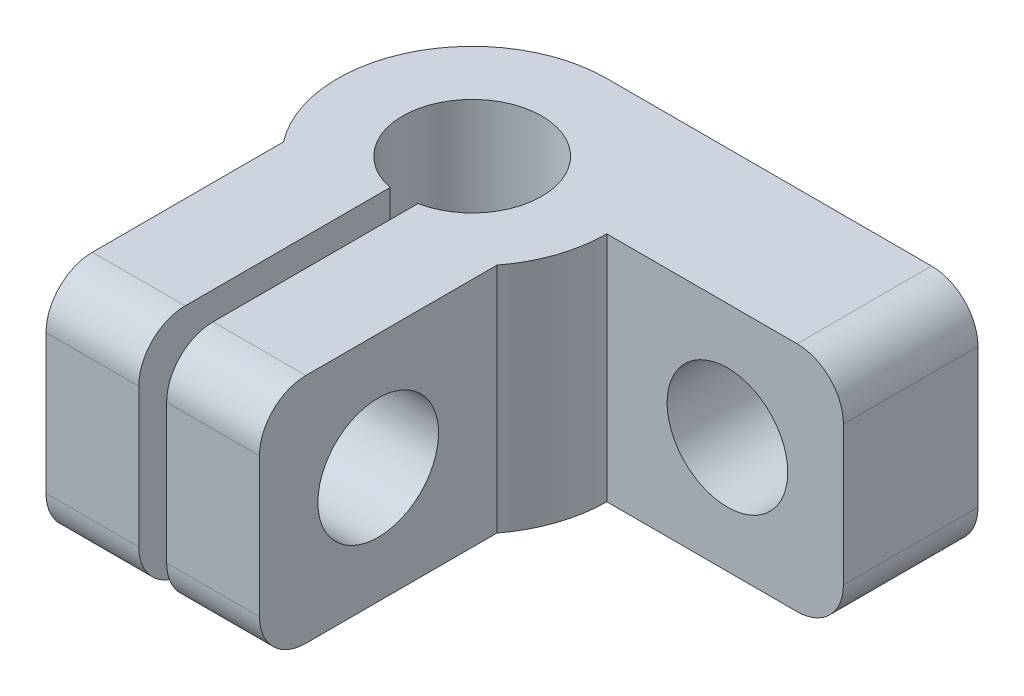
ISO-10303-21;
HEADER;
FILE_DESCRIPTION(('STEP AP214'),'2;1');
FILE_NAME('part.step','',(''),(''),'','','');
FILE_SCHEMA(('AUTOMOTIVE_DESIGN { 1 0 10303 214 1 1 1 1 }'));
ENDSEC;
DATA;
#1=APPLICATION_CONTEXT('core data for automotive mechanical design processes');
#2=APPLICATION_PROTOCOL_DEFINITION('international standard','automotive_design',2000,#1);
#3=PRODUCT_CONTEXT('',#1,'mechanical');
#4=PRODUCT('Part','Part','',(#3));
#5=PRODUCT_RELATED_PRODUCT_CATEGORY('part','',(#4));
#6=PRODUCT_DEFINITION_FORMATION('','',#4);
#7=PRODUCT_DEFINITION_CONTEXT('part definition',#1,'design');
#8=PRODUCT_DEFINITION('design','',#6,#7);
#9=PRODUCT_DEFINITION_SHAPE('','',#8);
#10=(LENGTH_UNIT() NAMED_UNIT(*) SI_UNIT(.MILLI.,.METRE.));
#11=(NAMED_UNIT(*) PLANE_ANGLE_UNIT() SI_UNIT($,.RADIAN.));
#12=(NAMED_UNIT(*) SI_UNIT($,.STERADIAN.) SOLID_ANGLE_UNIT());
#13=UNCERTAINTY_MEASURE_WITH_UNIT(LENGTH_MEASURE(1.E-05),#10,'distance_accuracy_value','');
#14=(GEOMETRIC_REPRESENTATION_CONTEXT(3) GLOBAL_UNCERTAINTY_ASSIGNED_CONTEXT((#13)) GLOBAL_UNIT_ASSIGNED_CONTEXT((#10,
#11,#12)) REPRESENTATION_CONTEXT('',''));
#15=CARTESIAN_POINT('',(0.,0.,0.));
#16=DIRECTION('',(0.,0.,1.));
#17=DIRECTION('',(1.,0.,0.));
#18=AXIS2_PLACEMENT_3D('',#15,#16,#17);
#19=CARTESIAN_POINT('',(2.3,5.,0.));
#20=DIRECTION('',(-1.,0.,0.));
#21=DIRECTION('',(0.,0.,1.));
#22=AXIS2_PLACEMENT_3D('',#19,#20,#21);
#23=PLANE('',#22);
#24=CARTESIAN_POINT('',(2.3,2.5,4.32539659681838));
#25=DIRECTION('',(-1.,0.,0.));
#26=DIRECTION('',(0.,0.,1.));
#27=AXIS2_PLACEMENT_3D('',#24,#25,#26);
#28=CIRCLE('',#27,1.3);
#29=CARTESIAN_POINT('',(2.3,2.5,5.62539659681838));
#30=VERTEX_POINT('',#29);
#31=EDGE_CURVE('E307',#30,#30,#28,.T.);
#32=ORIENTED_EDGE('',*,*,#31,.T.);
#33=EDGE_LOOP('',(#32));
#34=FACE_BOUND('',#33,.T.);
#35=DIRECTION('',(0.,-1.,0.));
#36=VECTOR('',#35,1.);
#37=CARTESIAN_POINT('',(2.3,5.,6.88444102037119));
#38=LINE('',#37,#36);
#39=CARTESIAN_POINT('',(2.3,4.,6.88444102037119));
#40=VERTEX_POINT('',#39);
#41=CARTESIAN_POINT('',(2.3,1.,6.88444102037119));
#42=VERTEX_POINT('',#41);
#43=EDGE_CURVE('E290',#40,#42,#38,.T.);
#44=ORIENTED_EDGE('',*,*,#43,.T.);
#45=CARTESIAN_POINT('',(2.3,1.,5.88444102037119));
#46=DIRECTION('',(-1.,0.,0.));
#47=DIRECTION('',(0.,0.,1.));
#48=AXIS2_PLACEMENT_3D('',#45,#46,#47);
#49=CIRCLE('',#48,1.);
#50=CARTESIAN_POINT('',(2.3,0.,5.88444102037119));
#51=VERTEX_POINT('',#50);
#52=EDGE_CURVE('E228',#42,#51,#49,.F.);
#53=ORIENTED_EDGE('',*,*,#52,.T.);
#54=DIRECTION('',(0.,0.,-1.));
#55=VECTOR('',#54,1.);
#56=CARTESIAN_POINT('',(2.3,0.,0.));
#57=LINE('',#56,#55);
#58=CARTESIAN_POINT('',(2.3,0.,1.76635217326557));
#59=VERTEX_POINT('',#58);
#60=EDGE_CURVE('E188',#51,#59,#57,.T.);
#61=ORIENTED_EDGE('',*,*,#60,.T.);
#62=DIRECTION('',(0.,-1.,0.));
#63=VECTOR('',#62,1.);
#64=CARTESIAN_POINT('',(2.3,5.,1.76635217326557));
#65=LINE('',#64,#63);
#66=CARTESIAN_POINT('',(2.3,5.,1.76635217326557));
#67=VERTEX_POINT('',#66);
#68=EDGE_CURVE('E181',#67,#59,#65,.T.);
#69=ORIENTED_EDGE('',*,*,#68,.F.);
#70=DIRECTION('',(0.,0.,-1.));
#71=VECTOR('',#70,1.);
#72=CARTESIAN_POINT('',(2.3,5.,0.));
#73=LINE('',#72,#71);
#74=CARTESIAN_POINT('',(2.3,5.,5.88444102037119));
#75=VERTEX_POINT('',#74);
#76=EDGE_CURVE('E165',#75,#67,#73,.T.);
#77=ORIENTED_EDGE('',*,*,#76,.F.);
#78=CARTESIAN_POINT('',(2.3,4.,5.88444102037119));
#79=DIRECTION('',(-1.,0.,0.));
#80=DIRECTION('',(0.,0.,1.));
#81=AXIS2_PLACEMENT_3D('',#78,#79,#80);
#82=CIRCLE('',#81,1.);
#83=EDGE_CURVE('E226',#75,#40,#82,.F.);
#84=ORIENTED_EDGE('',*,*,#83,.T.);
#85=EDGE_LOOP('',(#44,#53,#61,#69,#77,#84));
#86=FACE_BOUND('',#85,.T.);
#87=ADVANCED_FACE('F38',(#34,#86),#23,.F.);
#88=CARTESIAN_POINT('',(0.,5.,0.));
#89=DIRECTION('',(0.,-1.,0.));
#90=DIRECTION('',(0.,0.,-1.));
#91=AXIS2_PLACEMENT_3D('',#88,#89,#90);
#92=CYLINDRICAL_SURFACE('',#91,2.9);
#93=CARTESIAN_POINT('',(0.,0.,0.));
#94=DIRECTION('',(0.,1.,0.));
#95=DIRECTION('',(0.,0.,1.));
#96=AXIS2_PLACEMENT_3D('',#93,#94,#95);
#97=CIRCLE('',#96,2.9);
#98=CARTESIAN_POINT('',(2.9,0.,0.));
#99=VERTEX_POINT('',#98);
#100=EDGE_CURVE('E304',#59,#99,#97,.T.);
#101=ORIENTED_EDGE('',*,*,#100,.T.);
#102=DIRECTION('',(0.,-1.,0.));
#103=VECTOR('',#102,1.);
#104=CARTESIAN_POINT('',(2.9,5.,0.));
#105=LINE('',#104,#103);
#106=CARTESIAN_POINT('',(2.9,5.,0.));
#107=VERTEX_POINT('',#106);
#108=EDGE_CURVE('E183',#107,#99,#105,.T.);
#109=ORIENTED_EDGE('',*,*,#108,.F.);
#110=CARTESIAN_POINT('',(0.,5.,0.));
#111=DIRECTION('',(0.,1.,0.));
#112=DIRECTION('',(0.,0.,1.));
#113=AXIS2_PLACEMENT_3D('',#110,#111,#112);
#114=CIRCLE('',#113,2.9);
#115=EDGE_CURVE('E168',#67,#107,#114,.T.);
#116=ORIENTED_EDGE('',*,*,#115,.F.);
#117=ORIENTED_EDGE('',*,*,#68,.T.);
#118=EDGE_LOOP('',(#101,#109,#116,#117));
#119=FACE_BOUND('',#118,.T.);
#120=ADVANCED_FACE('F180',(#119),#92,.T.);
#121=CARTESIAN_POINT('',(0.,5.,0.));
#122=DIRECTION('',(0.,0.,1.));
#123=DIRECTION('',(1.,0.,0.));
#124=AXIS2_PLACEMENT_3D('',#121,#122,#123);
#125=PLANE('',#124);
#126=CARTESIAN_POINT('',(5.5,2.5,0.));
#127=DIRECTION('',(0.,0.,1.));
#128=DIRECTION('',(1.,0.,0.));
#129=AXIS2_PLACEMENT_3D('',#126,#127,#128);
#130=CIRCLE('',#129,1.3);
#131=CARTESIAN_POINT('',(6.8,2.5,0.));
#132=VERTEX_POINT('',#131);
#133=EDGE_CURVE('E329',#132,#132,#130,.T.);
#134=ORIENTED_EDGE('',*,*,#133,.F.);
#135=EDGE_LOOP('',(#134));
#136=FACE_BOUND('',#135,.T.);
#137=DIRECTION('',(-1.,0.,0.));
#138=VECTOR('',#137,1.);
#139=CARTESIAN_POINT('',(0.,0.,0.));
#140=LINE('',#139,#138);
#141=CARTESIAN_POINT('',(7.,0.,0.));
#142=VERTEX_POINT('',#141);
#143=EDGE_CURVE('E261',#142,#99,#140,.T.);
#144=ORIENTED_EDGE('',*,*,#143,.F.);
#145=CARTESIAN_POINT('',(7.,1.,0.));
#146=DIRECTION('',(0.,0.,1.));
#147=DIRECTION('',(1.,0.,0.));
#148=AXIS2_PLACEMENT_3D('',#145,#146,#147);
#149=CIRCLE('',#148,1.);
#150=CARTESIAN_POINT('',(8.,1.,0.));
#151=VERTEX_POINT('',#150);
#152=EDGE_CURVE('E239',#142,#151,#149,.T.);
#153=ORIENTED_EDGE('',*,*,#152,.T.);
#154=DIRECTION('',(0.,-1.,0.));
#155=VECTOR('',#154,1.);
#156=CARTESIAN_POINT('',(8.,5.,0.));
#157=LINE('',#156,#155);
#158=CARTESIAN_POINT('',(8.,4.,0.));
#159=VERTEX_POINT('',#158);
#160=EDGE_CURVE('E194',#159,#151,#157,.T.);
#161=ORIENTED_EDGE('',*,*,#160,.F.);
#162=CARTESIAN_POINT('',(7.,4.,0.));
#163=DIRECTION('',(0.,0.,1.));
#164=DIRECTION('',(1.,0.,0.));
#165=AXIS2_PLACEMENT_3D('',#162,#163,#164);
#166=CIRCLE('',#165,1.);
#167=CARTESIAN_POINT('',(7.,5.,0.));
#168=VERTEX_POINT('',#167);
#169=EDGE_CURVE('E237',#159,#168,#166,.T.);
#170=ORIENTED_EDGE('',*,*,#169,.T.);
#171=DIRECTION('',(-1.,0.,0.));
#172=VECTOR('',#171,1.);
#173=CARTESIAN_POINT('',(0.,5.,0.));
#174=LINE('',#173,#172);
#175=EDGE_CURVE('E184',#168,#107,#174,.T.);
#176=ORIENTED_EDGE('',*,*,#175,.T.);
#177=ORIENTED_EDGE('',*,*,#108,.T.);
#178=EDGE_LOOP('',(#144,#153,#161,#170,#176,#177));
#179=FACE_BOUND('',#178,.T.);
#180=ADVANCED_FACE('F266',(#136,#179),#125,.T.);
#181=CARTESIAN_POINT('',(8.,5.,0.));
#182=DIRECTION('',(1.,0.,0.));
#183=DIRECTION('',(0.,0.,-1.));
#184=AXIS2_PLACEMENT_3D('',#181,#182,#183);
#185=PLANE('',#184);
#186=ORIENTED_EDGE('',*,*,#160,.T.);
#187=DIRECTION('',(0.,0.,1.));
#188=VECTOR('',#187,1.);
#189=CARTESIAN_POINT('',(8.,1.,-2.9));
#190=LINE('',#189,#188);
#191=CARTESIAN_POINT('',(8.,1.,-2.9));
#192=VERTEX_POINT('',#191);
#193=EDGE_CURVE('E59',#151,#192,#190,.F.);
#194=ORIENTED_EDGE('',*,*,#193,.T.);
#195=DIRECTION('',(0.,-1.,0.));
#196=VECTOR('',#195,1.);
#197=CARTESIAN_POINT('',(8.,5.,-2.9));
#198=LINE('',#197,#196);
#199=CARTESIAN_POINT('',(8.,4.,-2.9));
#200=VERTEX_POINT('',#199);
#201=EDGE_CURVE('E252',#200,#192,#198,.T.);
#202=ORIENTED_EDGE('',*,*,#201,.F.);
#203=DIRECTION('',(0.,0.,1.));
#204=VECTOR('',#203,1.);
#205=CARTESIAN_POINT('',(8.,4.,0.));
#206=LINE('',#205,#204);
#207=EDGE_CURVE('E241',#200,#159,#206,.T.);
#208=ORIENTED_EDGE('',*,*,#207,.T.);
#209=EDGE_LOOP('',(#186,#194,#202,#208));
#210=FACE_BOUND('',#209,.T.);
#211=ADVANCED_FACE('F267',(#210),#185,.T.);
#212=CARTESIAN_POINT('',(0.,5.,-2.9));
#213=DIRECTION('',(0.,0.,-1.));
#214=DIRECTION('',(-1.,0.,0.));
#215=AXIS2_PLACEMENT_3D('',#212,#213,#214);
#216=PLANE('',#215);
#217=CARTESIAN_POINT('',(5.5,2.5,-2.9));
#218=DIRECTION('',(0.,0.,-1.));
#219=DIRECTION('',(-1.,0.,0.));
#220=AXIS2_PLACEMENT_3D('',#217,#218,#219);
#221=CIRCLE('',#220,1.3);
#222=CARTESIAN_POINT('',(4.2,2.5,-2.9));
#223=VERTEX_POINT('',#222);
#224=EDGE_CURVE('E332',#223,#223,#221,.T.);
#225=ORIENTED_EDGE('',*,*,#224,.F.);
#226=EDGE_LOOP('',(#225));
#227=FACE_BOUND('',#226,.T.);
#228=ORIENTED_EDGE('',*,*,#201,.T.);
#229=CARTESIAN_POINT('',(7.,1.,-2.9));
#230=DIRECTION('',(0.,0.,-1.));
#231=DIRECTION('',(-1.,0.,0.));
#232=AXIS2_PLACEMENT_3D('',#229,#230,#231);
#233=CIRCLE('',#232,1.);
#234=CARTESIAN_POINT('',(7.,0.,-2.9));
#235=VERTEX_POINT('',#234);
#236=EDGE_CURVE('E46',#192,#235,#233,.T.);
#237=ORIENTED_EDGE('',*,*,#236,.T.);
#238=DIRECTION('',(1.,0.,0.));
#239=VECTOR('',#238,1.);
#240=CARTESIAN_POINT('',(0.,0.,-2.9));
#241=LINE('',#240,#239);
#242=CARTESIAN_POINT('',(0.,0.,-2.9));
#243=VERTEX_POINT('',#242);
#244=EDGE_CURVE('E251',#243,#235,#241,.T.);
#245=ORIENTED_EDGE('',*,*,#244,.F.);
#246=DIRECTION('',(0.,-1.,0.));
#247=VECTOR('',#246,1.);
#248=CARTESIAN_POINT('',(0.,5.,-2.9));
#249=LINE('',#248,#247);
#250=CARTESIAN_POINT('',(0.,5.,-2.9));
#251=VERTEX_POINT('',#250);
#252=EDGE_CURVE('E269',#251,#243,#249,.T.);
#253=ORIENTED_EDGE('',*,*,#252,.F.);
#254=DIRECTION('',(1.,0.,0.));
#255=VECTOR('',#254,1.);
#256=CARTESIAN_POINT('',(0.,5.,-2.9));
#257=LINE('',#256,#255);
#258=CARTESIAN_POINT('',(7.,5.,-2.9));
#259=VERTEX_POINT('',#258);
#260=EDGE_CURVE('E320',#251,#259,#257,.T.);
#261=ORIENTED_EDGE('',*,*,#260,.T.);
#262=CARTESIAN_POINT('',(7.,4.,-2.9));
#263=DIRECTION('',(0.,0.,-1.));
#264=DIRECTION('',(-1.,0.,0.));
#265=AXIS2_PLACEMENT_3D('',#262,#263,#264);
#266=CIRCLE('',#265,1.);
#267=EDGE_CURVE('E245',#259,#200,#266,.T.);
#268=ORIENTED_EDGE('',*,*,#267,.T.);
#269=EDGE_LOOP('',(#228,#237,#245,#253,#261,#268));
#270=FACE_BOUND('',#269,.T.);
#271=ADVANCED_FACE('F250',(#227,#270),#216,.T.);
#272=CARTESIAN_POINT('',(0.,5.,0.));
#273=DIRECTION('',(0.,-1.,0.));
#274=DIRECTION('',(0.,0.,-1.));
#275=AXIS2_PLACEMENT_3D('',#272,#273,#274);
#276=CYLINDRICAL_SURFACE('',#275,2.9);
#277=CARTESIAN_POINT('',(0.,0.,0.));
#278=DIRECTION('',(0.,1.,0.));
#279=DIRECTION('',(0.,0.,1.));
#280=AXIS2_PLACEMENT_3D('',#277,#278,#279);
#281=CIRCLE('',#280,2.9);
#282=CARTESIAN_POINT('',(-2.3,0.,1.76635217326557));
#283=VERTEX_POINT('',#282);
#284=EDGE_CURVE('E260',#243,#283,#281,.T.);
#285=ORIENTED_EDGE('',*,*,#284,.T.);
#286=DIRECTION('',(0.,-1.,0.));
#287=VECTOR('',#286,1.);
#288=CARTESIAN_POINT('',(-2.3,5.,1.76635217326557));
#289=LINE('',#288,#287);
#290=CARTESIAN_POINT('',(-2.3,5.,1.76635217326557));
#291=VERTEX_POINT('',#290);
#292=EDGE_CURVE('E273',#291,#283,#289,.T.);
#293=ORIENTED_EDGE('',*,*,#292,.F.);
#294=CARTESIAN_POINT('',(0.,5.,0.));
#295=DIRECTION('',(0.,1.,0.));
#296=DIRECTION('',(0.,0.,1.));
#297=AXIS2_PLACEMENT_3D('',#294,#295,#296);
#298=CIRCLE('',#297,2.9);
#299=EDGE_CURVE('E317',#251,#291,#298,.T.);
#300=ORIENTED_EDGE('',*,*,#299,.F.);
#301=ORIENTED_EDGE('',*,*,#252,.T.);
#302=EDGE_LOOP('',(#285,#293,#300,#301));
#303=FACE_BOUND('',#302,.T.);
#304=ADVANCED_FACE('F339',(#303),#276,.T.);
#305=CARTESIAN_POINT('',(-2.3,5.,0.));
#306=DIRECTION('',(-1.,0.,0.));
#307=DIRECTION('',(0.,0.,1.));
#308=AXIS2_PLACEMENT_3D('',#305,#306,#307);
#309=PLANE('',#308);
#310=CARTESIAN_POINT('',(-2.3,2.5,4.32539659681838));
#311=DIRECTION('',(-1.,0.,0.));
#312=DIRECTION('',(0.,0.,1.));
#313=AXIS2_PLACEMENT_3D('',#310,#311,#312);
#314=CIRCLE('',#313,1.3);
#315=CARTESIAN_POINT('',(-2.3,2.5,5.62539659681838));
#316=VERTEX_POINT('',#315);
#317=EDGE_CURVE('E201',#316,#316,#314,.T.);
#318=ORIENTED_EDGE('',*,*,#317,.F.);
#319=EDGE_LOOP('',(#318));
#320=FACE_BOUND('',#319,.T.);
#321=DIRECTION('',(0.,-1.,0.));
#322=VECTOR('',#321,1.);
#323=CARTESIAN_POINT('',(-2.3,5.,6.88444102037119));
#324=LINE('',#323,#322);
#325=CARTESIAN_POINT('',(-2.3,4.,6.88444102037119));
#326=VERTEX_POINT('',#325);
#327=CARTESIAN_POINT('',(-2.3,1.,6.88444102037119));
#328=VERTEX_POINT('',#327);
#329=EDGE_CURVE('E276',#326,#328,#324,.T.);
#330=ORIENTED_EDGE('',*,*,#329,.F.);
#331=CARTESIAN_POINT('',(-2.3,4.,5.88444102037119));
#332=DIRECTION('',(-1.,0.,0.));
#333=DIRECTION('',(0.,0.,1.));
#334=AXIS2_PLACEMENT_3D('',#331,#332,#333);
#335=CIRCLE('',#334,1.);
#336=CARTESIAN_POINT('',(-2.3,5.,5.88444102037119));
#337=VERTEX_POINT('',#336);
#338=EDGE_CURVE('E207',#326,#337,#335,.T.);
#339=ORIENTED_EDGE('',*,*,#338,.T.);
#340=DIRECTION('',(0.,0.,-1.));
#341=VECTOR('',#340,1.);
#342=CARTESIAN_POINT('',(-2.3,5.,0.));
#343=LINE('',#342,#341);
#344=EDGE_CURVE('E315',#337,#291,#343,.T.);
#345=ORIENTED_EDGE('',*,*,#344,.T.);
#346=ORIENTED_EDGE('',*,*,#292,.T.);
#347=DIRECTION('',(0.,0.,-1.));
#348=VECTOR('',#347,1.);
#349=CARTESIAN_POINT('',(-2.3,0.,0.));
#350=LINE('',#349,#348);
#351=CARTESIAN_POINT('',(-2.3,0.,5.88444102037119));
#352=VERTEX_POINT('',#351);
#353=EDGE_CURVE('E300',#352,#283,#350,.T.);
#354=ORIENTED_EDGE('',*,*,#353,.F.);
#355=CARTESIAN_POINT('',(-2.3,1.,5.88444102037119));
#356=DIRECTION('',(-1.,0.,0.));
#357=DIRECTION('',(0.,0.,1.));
#358=AXIS2_PLACEMENT_3D('',#355,#356,#357);
#359=CIRCLE('',#358,1.);
#360=EDGE_CURVE('E205',#352,#328,#359,.T.);
#361=ORIENTED_EDGE('',*,*,#360,.T.);
#362=EDGE_LOOP('',(#330,#339,#345,#346,#354,#361));
#363=FACE_BOUND('',#362,.T.);
#364=ADVANCED_FACE('F345',(#320,#363),#309,.T.);
#365=CARTESIAN_POINT('',(0.,5.,6.88444102037119));
#366=DIRECTION('',(0.,0.,1.));
#367=DIRECTION('',(1.,0.,0.));
#368=AXIS2_PLACEMENT_3D('',#365,#366,#367);
#369=PLANE('',#368);
#370=DIRECTION('',(0.,-1.,0.));
#371=VECTOR('',#370,1.);
#372=CARTESIAN_POINT('',(-0.299999999999999,5.,6.88444102037119));
#373=LINE('',#372,#371);
#374=CARTESIAN_POINT('',(-0.299999999999999,4.,6.88444102037119));
#375=VERTEX_POINT('',#374);
#376=CARTESIAN_POINT('',(-0.299999999999999,1.,6.88444102037119));
#377=VERTEX_POINT('',#376);
#378=EDGE_CURVE('E279',#375,#377,#373,.T.);
#379=ORIENTED_EDGE('',*,*,#378,.F.);
#380=DIRECTION('',(-1.,0.,0.));
#381=VECTOR('',#380,1.);
#382=CARTESIAN_POINT('',(0.,4.,6.88444102037119));
#383=LINE('',#382,#381);
#384=EDGE_CURVE('E192',#375,#326,#383,.T.);
#385=ORIENTED_EDGE('',*,*,#384,.T.);
#386=ORIENTED_EDGE('',*,*,#329,.T.);
#387=DIRECTION('',(-1.,0.,0.));
#388=VECTOR('',#387,1.);
#389=CARTESIAN_POINT('',(-0.299999999999999,1.,6.88444102037119));
#390=LINE('',#389,#388);
#391=EDGE_CURVE('E190',#328,#377,#390,.F.);
#392=ORIENTED_EDGE('',*,*,#391,.T.);
#393=EDGE_LOOP('',(#379,#385,#386,#392));
#394=FACE_BOUND('',#393,.T.);
#395=ADVANCED_FACE('F392',(#394),#369,.T.);
#396=CARTESIAN_POINT('',(-0.3,5.,0.));
#397=DIRECTION('',(1.,0.,0.));
#398=DIRECTION('',(0.,0.,-1.));
#399=AXIS2_PLACEMENT_3D('',#396,#397,#398);
#400=PLANE('',#399);
#401=CARTESIAN_POINT('',(-0.3,2.5,4.32539659681838));
#402=DIRECTION('',(1.,0.,0.));
#403=DIRECTION('',(0.,0.,-1.));
#404=AXIS2_PLACEMENT_3D('',#401,#402,#403);
#405=CIRCLE('',#404,1.3);
#406=CARTESIAN_POINT('',(-0.3,2.5,5.62539659681838));
#407=VERTEX_POINT('',#406);
#408=EDGE_CURVE('E200',#407,#407,#405,.T.);
#409=ORIENTED_EDGE('',*,*,#408,.F.);
#410=EDGE_LOOP('',(#409));
#411=FACE_BOUND('',#410,.T.);
#412=DIRECTION('',(0.,0.,1.));
#413=VECTOR('',#412,1.);
#414=CARTESIAN_POINT('',(-0.3,5.,0.));
#415=LINE('',#414,#413);
#416=CARTESIAN_POINT('',(-0.3,5.,1.46969384566991));
#417=VERTEX_POINT('',#416);
#418=CARTESIAN_POINT('',(-0.299999999999999,5.,5.88444102037119));
#419=VERTEX_POINT('',#418);
#420=EDGE_CURVE('E312',#417,#419,#415,.T.);
#421=ORIENTED_EDGE('',*,*,#420,.T.);
#422=CARTESIAN_POINT('',(-0.299999999999999,4.,5.88444102037119));
#423=DIRECTION('',(1.,0.,0.));
#424=DIRECTION('',(0.,0.,-1.));
#425=AXIS2_PLACEMENT_3D('',#422,#423,#424);
#426=CIRCLE('',#425,1.);
#427=EDGE_CURVE('E214',#419,#375,#426,.T.);
#428=ORIENTED_EDGE('',*,*,#427,.T.);
#429=ORIENTED_EDGE('',*,*,#378,.T.);
#430=CARTESIAN_POINT('',(-0.299999999999999,1.,5.88444102037119));
#431=DIRECTION('',(1.,0.,0.));
#432=DIRECTION('',(0.,0.,-1.));
#433=AXIS2_PLACEMENT_3D('',#430,#431,#432);
#434=CIRCLE('',#433,1.);
#435=CARTESIAN_POINT('',(-0.299999999999999,0.,5.88444102037119));
#436=VERTEX_POINT('',#435);
#437=EDGE_CURVE('E212',#377,#436,#434,.T.);
#438=ORIENTED_EDGE('',*,*,#437,.T.);
#439=DIRECTION('',(0.,0.,1.));
#440=VECTOR('',#439,1.);
#441=CARTESIAN_POINT('',(-0.3,0.,0.));
#442=LINE('',#441,#440);
#443=CARTESIAN_POINT('',(-0.3,0.,1.46969384566991));
#444=VERTEX_POINT('',#443);
#445=EDGE_CURVE('E297',#444,#436,#442,.T.);
#446=ORIENTED_EDGE('',*,*,#445,.F.);
#447=DIRECTION('',(0.,-1.,0.));
#448=VECTOR('',#447,1.);
#449=CARTESIAN_POINT('',(-0.3,5.,1.46969384566991));
#450=LINE('',#449,#448);
#451=EDGE_CURVE('E282',#417,#444,#450,.T.);
#452=ORIENTED_EDGE('',*,*,#451,.F.);
#453=EDGE_LOOP('',(#421,#428,#429,#438,#446,#452));
#454=FACE_BOUND('',#453,.T.);
#455=ADVANCED_FACE('F396',(#411,#454),#400,.T.);
#456=CARTESIAN_POINT('',(0.,5.,0.));
#457=DIRECTION('',(0.,-1.,0.));
#458=DIRECTION('',(0.,0.,-1.));
#459=AXIS2_PLACEMENT_3D('',#456,#457,#458);
#460=CYLINDRICAL_SURFACE('',#459,1.5);
#461=CARTESIAN_POINT('',(0.,0.,0.));
#462=DIRECTION('',(0.,1.,0.));
#463=DIRECTION('',(0.,0.,1.));
#464=AXIS2_PLACEMENT_3D('',#461,#462,#463);
#465=CIRCLE('',#464,1.5);
#466=CARTESIAN_POINT('',(0.3,0.,1.46969384566991));
#467=VERTEX_POINT('',#466);
#468=EDGE_CURVE('E294',#467,#444,#465,.T.);
#469=ORIENTED_EDGE('',*,*,#468,.F.);
#470=DIRECTION('',(0.,-1.,0.));
#471=VECTOR('',#470,1.);
#472=CARTESIAN_POINT('',(0.3,5.,1.46969384566991));
#473=LINE('',#472,#471);
#474=CARTESIAN_POINT('',(0.3,5.,1.46969384566991));
#475=VERTEX_POINT('',#474);
#476=EDGE_CURVE('E284',#475,#467,#473,.T.);
#477=ORIENTED_EDGE('',*,*,#476,.F.);
#478=CARTESIAN_POINT('',(0.,5.,0.));
#479=DIRECTION('',(0.,1.,0.));
#480=DIRECTION('',(0.,0.,1.));
#481=AXIS2_PLACEMENT_3D('',#478,#479,#480);
#482=CIRCLE('',#481,1.5);
#483=EDGE_CURVE('E309',#475,#417,#482,.T.);
#484=ORIENTED_EDGE('',*,*,#483,.T.);
#485=ORIENTED_EDGE('',*,*,#451,.T.);
#486=EDGE_LOOP('',(#469,#477,#484,#485));
#487=FACE_BOUND('',#486,.T.);
#488=ADVANCED_FACE('F404',(#487),#460,.F.);
#489=CARTESIAN_POINT('',(0.3,5.,0.));
#490=DIRECTION('',(-1.,0.,0.));
#491=DIRECTION('',(0.,0.,1.));
#492=AXIS2_PLACEMENT_3D('',#489,#490,#491);
#493=PLANE('',#492);
#494=CARTESIAN_POINT('',(0.300000000000001,2.5,4.32539659681838));
#495=DIRECTION('',(-1.,0.,0.));
#496=DIRECTION('',(0.,0.,1.));
#497=AXIS2_PLACEMENT_3D('',#494,#495,#496);
#498=CIRCLE('',#497,1.3);
#499=CARTESIAN_POINT('',(0.300000000000001,2.5,5.62539659681838));
#500=VERTEX_POINT('',#499);
#501=EDGE_CURVE('E198',#500,#500,#498,.T.);
#502=ORIENTED_EDGE('',*,*,#501,.F.);
#503=EDGE_LOOP('',(#502));
#504=FACE_BOUND('',#503,.T.);
#505=DIRECTION('',(0.,0.,-1.));
#506=VECTOR('',#505,1.);
#507=CARTESIAN_POINT('',(0.3,0.,0.));
#508=LINE('',#507,#506);
#509=CARTESIAN_POINT('',(0.3,0.,5.88444102037119));
#510=VERTEX_POINT('',#509);
#511=EDGE_CURVE('E175',#510,#467,#508,.T.);
#512=ORIENTED_EDGE('',*,*,#511,.F.);
#513=CARTESIAN_POINT('',(0.3,1.,5.88444102037119));
#514=DIRECTION('',(-1.,0.,0.));
#515=DIRECTION('',(0.,0.,1.));
#516=AXIS2_PLACEMENT_3D('',#513,#514,#515);
#517=CIRCLE('',#516,1.);
#518=CARTESIAN_POINT('',(0.300000000000001,1.,6.88444102037119));
#519=VERTEX_POINT('',#518);
#520=EDGE_CURVE('E232',#510,#519,#517,.T.);
#521=ORIENTED_EDGE('',*,*,#520,.T.);
#522=DIRECTION('',(0.,-1.,0.));
#523=VECTOR('',#522,1.);
#524=CARTESIAN_POINT('',(0.300000000000001,5.,6.88444102037119));
#525=LINE('',#524,#523);
#526=CARTESIAN_POINT('',(0.300000000000001,4.,6.88444102037119));
#527=VERTEX_POINT('',#526);
#528=EDGE_CURVE('E287',#527,#519,#525,.T.);
#529=ORIENTED_EDGE('',*,*,#528,.F.);
#530=CARTESIAN_POINT('',(0.3,4.,5.88444102037119));
#531=DIRECTION('',(-1.,0.,0.));
#532=DIRECTION('',(0.,0.,1.));
#533=AXIS2_PLACEMENT_3D('',#530,#531,#532);
#534=CIRCLE('',#533,1.);
#535=CARTESIAN_POINT('',(0.3,5.,5.88444102037119));
#536=VERTEX_POINT('',#535);
#537=EDGE_CURVE('E230',#527,#536,#534,.T.);
#538=ORIENTED_EDGE('',*,*,#537,.T.);
#539=DIRECTION('',(0.,0.,-1.));
#540=VECTOR('',#539,1.);
#541=CARTESIAN_POINT('',(0.3,5.,0.));
#542=LINE('',#541,#540);
#543=EDGE_CURVE('E292',#536,#475,#542,.T.);
#544=ORIENTED_EDGE('',*,*,#543,.T.);
#545=ORIENTED_EDGE('',*,*,#476,.T.);
#546=EDGE_LOOP('',(#512,#521,#529,#538,#544,#545));
#547=FACE_BOUND('',#546,.T.);
#548=ADVANCED_FACE('F407',(#504,#547),#493,.T.);
#549=CARTESIAN_POINT('',(0.,5.,6.88444102037119));
#550=DIRECTION('',(0.,0.,-1.));
#551=DIRECTION('',(-1.,0.,0.));
#552=AXIS2_PLACEMENT_3D('',#549,#550,#551);
#553=PLANE('',#552);
#554=ORIENTED_EDGE('',*,*,#528,.T.);
#555=DIRECTION('',(1.,0.,0.));
#556=VECTOR('',#555,1.);
#557=CARTESIAN_POINT('',(0.,1.,6.88444102037119));
#558=LINE('',#557,#556);
#559=EDGE_CURVE('E223',#519,#42,#558,.T.);
#560=ORIENTED_EDGE('',*,*,#559,.T.);
#561=ORIENTED_EDGE('',*,*,#43,.F.);
#562=DIRECTION('',(1.,0.,0.));
#563=VECTOR('',#562,1.);
#564=CARTESIAN_POINT('',(0.300000000000001,4.,6.88444102037119));
#565=LINE('',#564,#563);
#566=EDGE_CURVE('E221',#40,#527,#565,.F.);
#567=ORIENTED_EDGE('',*,*,#566,.T.);
#568=EDGE_LOOP('',(#554,#560,#561,#567));
#569=FACE_BOUND('',#568,.T.);
#570=ADVANCED_FACE('F414',(#569),#553,.F.);
#571=CARTESIAN_POINT('',(0.,5.,0.));
#572=DIRECTION('',(0.,1.,0.));
#573=DIRECTION('',(0.,0.,1.));
#574=AXIS2_PLACEMENT_3D('',#571,#572,#573);
#575=PLANE('',#574);
#576=ORIENTED_EDGE('',*,*,#175,.F.);
#577=DIRECTION('',(0.,0.,1.));
#578=VECTOR('',#577,1.);
#579=CARTESIAN_POINT('',(7.,5.,0.));
#580=LINE('',#579,#578);
#581=EDGE_CURVE('E11',#168,#259,#580,.F.);
#582=ORIENTED_EDGE('',*,*,#581,.T.);
#583=ORIENTED_EDGE('',*,*,#260,.F.);
#584=ORIENTED_EDGE('',*,*,#299,.T.);
#585=ORIENTED_EDGE('',*,*,#344,.F.);
#586=DIRECTION('',(-1.,0.,0.));
#587=VECTOR('',#586,1.);
#588=CARTESIAN_POINT('',(0.,5.,5.88444102037119));
#589=LINE('',#588,#587);
#590=EDGE_CURVE('E210',#337,#419,#589,.F.);
#591=ORIENTED_EDGE('',*,*,#590,.T.);
#592=ORIENTED_EDGE('',*,*,#420,.F.);
#593=ORIENTED_EDGE('',*,*,#483,.F.);
#594=ORIENTED_EDGE('',*,*,#543,.F.);
#595=DIRECTION('',(1.,0.,0.));
#596=VECTOR('',#595,1.);
#597=CARTESIAN_POINT('',(2.3,5.,5.88444102037119));
#598=LINE('',#597,#596);
#599=EDGE_CURVE('E172',#536,#75,#598,.T.);
#600=ORIENTED_EDGE('',*,*,#599,.T.);
#601=ORIENTED_EDGE('',*,*,#76,.T.);
#602=ORIENTED_EDGE('',*,*,#115,.T.);
#603=EDGE_LOOP('',(#576,#582,#583,#584,#585,#591,#592,#593,#594,#600,#601,#602));
#604=FACE_BOUND('',#603,.T.);
#605=ADVANCED_FACE('F167',(#604),#575,.T.);
#606=CARTESIAN_POINT('',(0.,0.,0.));
#607=DIRECTION('',(0.,1.,0.));
#608=DIRECTION('',(0.,0.,1.));
#609=AXIS2_PLACEMENT_3D('',#606,#607,#608);
#610=PLANE('',#609);
#611=ORIENTED_EDGE('',*,*,#244,.T.);
#612=DIRECTION('',(0.,0.,1.));
#613=VECTOR('',#612,1.);
#614=CARTESIAN_POINT('',(7.,0.,0.));
#615=LINE('',#614,#613);
#616=EDGE_CURVE('E234',#235,#142,#615,.T.);
#617=ORIENTED_EDGE('',*,*,#616,.T.);
#618=ORIENTED_EDGE('',*,*,#143,.T.);
#619=ORIENTED_EDGE('',*,*,#100,.F.);
#620=ORIENTED_EDGE('',*,*,#60,.F.);
#621=DIRECTION('',(1.,0.,0.));
#622=VECTOR('',#621,1.);
#623=CARTESIAN_POINT('',(0.,0.,5.88444102037119));
#624=LINE('',#623,#622);
#625=EDGE_CURVE('E216',#51,#510,#624,.F.);
#626=ORIENTED_EDGE('',*,*,#625,.T.);
#627=ORIENTED_EDGE('',*,*,#511,.T.);
#628=ORIENTED_EDGE('',*,*,#468,.T.);
#629=ORIENTED_EDGE('',*,*,#445,.T.);
#630=DIRECTION('',(-1.,0.,0.));
#631=VECTOR('',#630,1.);
#632=CARTESIAN_POINT('',(-2.3,0.,5.88444102037119));
#633=LINE('',#632,#631);
#634=EDGE_CURVE('E218',#436,#352,#633,.T.);
#635=ORIENTED_EDGE('',*,*,#634,.T.);
#636=ORIENTED_EDGE('',*,*,#353,.T.);
#637=ORIENTED_EDGE('',*,*,#284,.F.);
#638=EDGE_LOOP('',(#611,#617,#618,#619,#620,#626,#627,#628,#629,#635,#636,#637));
#639=FACE_BOUND('',#638,.T.);
#640=ADVANCED_FACE('F257',(#639),#610,.F.);
#641=CARTESIAN_POINT('',(8.,2.5,4.32539659681838));
#642=DIRECTION('',(-1.,0.,0.));
#643=DIRECTION('',(0.,0.,1.));
#644=AXIS2_PLACEMENT_3D('',#641,#642,#643);
#645=CYLINDRICAL_SURFACE('',#644,1.3);
#646=CARTESIAN_POINT('',(0.300000000000001,2.5,5.62539659681838));
#647=CARTESIAN_POINT('',(0.320833333333334,2.5,5.62539659681838));
#648=CARTESIAN_POINT('',(0.341666666666667,2.5,5.62539659681838));
#649=CARTESIAN_POINT('',(0.383333333333334,2.5,5.62539659681838));
#650=CARTESIAN_POINT('',(0.404166666666668,2.5,5.62539659681838));
#651=CARTESIAN_POINT('',(0.445833333333334,2.5,5.62539659681838));
#652=CARTESIAN_POINT('',(0.466666666666668,2.5,5.62539659681838));
#653=CARTESIAN_POINT('',(0.508333333333334,2.5,5.62539659681838));
#654=CARTESIAN_POINT('',(0.529166666666668,2.5,5.62539659681838));
#655=CARTESIAN_POINT('',(0.570833333333334,2.5,5.62539659681838));
#656=CARTESIAN_POINT('',(0.591666666666668,2.5,5.62539659681838));
#657=CARTESIAN_POINT('',(0.633333333333334,2.5,5.62539659681838));
#658=CARTESIAN_POINT('',(0.654166666666668,2.5,5.62539659681838));
#659=CARTESIAN_POINT('',(0.695833333333334,2.5,5.62539659681838));
#660=CARTESIAN_POINT('',(0.716666666666668,2.5,5.62539659681838));
#661=CARTESIAN_POINT('',(0.758333333333335,2.5,5.62539659681838));
#662=CARTESIAN_POINT('',(0.779166666666668,2.5,5.62539659681838));
#663=CARTESIAN_POINT('',(0.820833333333335,2.5,5.62539659681838));
#664=CARTESIAN_POINT('',(0.841666666666668,2.5,5.62539659681838));
#665=CARTESIAN_POINT('',(0.883333333333334,2.5,5.62539659681838));
#666=CARTESIAN_POINT('',(0.904166666666667,2.5,5.62539659681838));
#667=CARTESIAN_POINT('',(0.945833333333334,2.5,5.62539659681838));
#668=CARTESIAN_POINT('',(0.966666666666667,2.5,5.62539659681838));
#669=CARTESIAN_POINT('',(1.00833333333333,2.5,5.62539659681838));
#670=CARTESIAN_POINT('',(1.02916666666667,2.5,5.62539659681838));
#671=CARTESIAN_POINT('',(1.07083333333333,2.5,5.62539659681838));
#672=CARTESIAN_POINT('',(1.09166666666667,2.5,5.62539659681838));
#673=CARTESIAN_POINT('',(1.13333333333333,2.5,5.62539659681838));
#674=CARTESIAN_POINT('',(1.15416666666667,2.5,5.62539659681838));
#675=CARTESIAN_POINT('',(1.19583333333333,2.5,5.62539659681838));
#676=CARTESIAN_POINT('',(1.21666666666667,2.5,5.62539659681838));
#677=CARTESIAN_POINT('',(1.25833333333333,2.5,5.62539659681838));
#678=CARTESIAN_POINT('',(1.27916666666667,2.5,5.62539659681838));
#679=CARTESIAN_POINT('',(1.32083333333333,2.5,5.62539659681838));
#680=CARTESIAN_POINT('',(1.34166666666667,2.5,5.62539659681838));
#681=CARTESIAN_POINT('',(1.38333333333333,2.5,5.62539659681838));
#682=CARTESIAN_POINT('',(1.40416666666667,2.5,5.62539659681838));
#683=CARTESIAN_POINT('',(1.44583333333333,2.5,5.62539659681838));
#684=CARTESIAN_POINT('',(1.46666666666667,2.5,5.62539659681838));
#685=CARTESIAN_POINT('',(1.50833333333333,2.5,5.62539659681838));
#686=CARTESIAN_POINT('',(1.52916666666667,2.5,5.62539659681838));
#687=CARTESIAN_POINT('',(1.57083333333333,2.5,5.62539659681838));
#688=CARTESIAN_POINT('',(1.59166666666667,2.5,5.62539659681838));
#689=CARTESIAN_POINT('',(1.63333333333333,2.5,5.62539659681838));
#690=CARTESIAN_POINT('',(1.65416666666667,2.5,5.62539659681838));
#691=CARTESIAN_POINT('',(1.69583333333333,2.5,5.62539659681838));
#692=CARTESIAN_POINT('',(1.71666666666667,2.5,5.62539659681838));
#693=CARTESIAN_POINT('',(1.75833333333333,2.5,5.62539659681838));
#694=CARTESIAN_POINT('',(1.77916666666667,2.5,5.62539659681838));
#695=CARTESIAN_POINT('',(1.82083333333333,2.5,5.62539659681838));
#696=CARTESIAN_POINT('',(1.84166666666667,2.5,5.62539659681838));
#697=CARTESIAN_POINT('',(1.88333333333333,2.5,5.62539659681838));
#698=CARTESIAN_POINT('',(1.90416666666667,2.5,5.62539659681838));
#699=CARTESIAN_POINT('',(1.94583333333333,2.5,5.62539659681838));
#700=CARTESIAN_POINT('',(1.96666666666667,2.5,5.62539659681838));
#701=CARTESIAN_POINT('',(2.00833333333333,2.5,5.62539659681838));
#702=CARTESIAN_POINT('',(2.02916666666667,2.5,5.62539659681838));
#703=CARTESIAN_POINT('',(2.07083333333333,2.5,5.62539659681838));
#704=CARTESIAN_POINT('',(2.09166666666667,2.5,5.62539659681838));
#705=CARTESIAN_POINT('',(2.13333333333333,2.5,5.62539659681838));
#706=CARTESIAN_POINT('',(2.15416666666667,2.5,5.62539659681838));
#707=CARTESIAN_POINT('',(2.19583333333333,2.5,5.62539659681838));
#708=CARTESIAN_POINT('',(2.21666666666667,2.5,5.62539659681838));
#709=CARTESIAN_POINT('',(2.25833333333333,2.5,5.62539659681838));
#710=CARTESIAN_POINT('',(2.27916666666667,2.5,5.62539659681838));
#711=CARTESIAN_POINT('',(2.3,2.5,5.62539659681838));
#712=B_SPLINE_CURVE_WITH_KNOTS('',3,(#646,#647,#648,#649,#650,#651,#652,#653,#654,#655,#656,
#657,#658,#659,#660,#661,#662,#663,#664,#665,#666,#667,#668,#669,#670,#671,#672,#673,#674,#675,
#676,#677,#678,#679,#680,#681,#682,#683,#684,#685,#686,#687,#688,#689,#690,#691,#692,#693,#694,
#695,#696,#697,#698,#699,#700,#701,#702,#703,#704,#705,#706,#707,#708,#709,#710,#711),
.UNSPECIFIED.,.F.,.F.,(4,2,2,2,2,2,2,2,2,2,2,2,2,2,2,2,2,2,2,2,2,2,2,2,2,2,2,2,2,2,2,2,4),(0.,
0.0625000000000001,0.125,0.1875,0.25,0.3125,0.375,0.4375,0.5,0.5625,0.625,0.6875,0.75,0.8125,
0.875,0.9375,1.,1.0625,1.125,1.1875,1.25,1.3125,1.375,1.4375,1.5,1.5625,1.625,1.6875,1.75,
1.8125,1.875,1.9375,2.),.UNSPECIFIED.);
#713=EDGE_CURVE('BSEAM443',#500,#30,#712,.T.);
#714=ORIENTED_EDGE('',*,*,#501,.T.);
#715=ORIENTED_EDGE('',*,*,#31,.F.);
#716=ORIENTED_EDGE('',*,*,#713,.T.);
#717=ORIENTED_EDGE('',*,*,#713,.F.);
#718=EDGE_LOOP('',(#714,#716,#715,#717));
#719=FACE_BOUND('',#718,.T.);
#720=ADVANCED_FACE('F443',(#719),#645,.F.);
#721=CARTESIAN_POINT('',(-0.3,2.5,5.62539659681838));
#722=CARTESIAN_POINT('',(-0.320833333333333,2.5,5.62539659681838));
#723=CARTESIAN_POINT('',(-0.341666666666667,2.5,5.62539659681838));
#724=CARTESIAN_POINT('',(-0.383333333333333,2.5,5.62539659681838));
#725=CARTESIAN_POINT('',(-0.404166666666667,2.5,5.62539659681838));
#726=CARTESIAN_POINT('',(-0.445833333333333,2.5,5.62539659681838));
#727=CARTESIAN_POINT('',(-0.466666666666667,2.5,5.62539659681838));
#728=CARTESIAN_POINT('',(-0.508333333333333,2.5,5.62539659681838));
#729=CARTESIAN_POINT('',(-0.529166666666667,2.5,5.62539659681838));
#730=CARTESIAN_POINT('',(-0.570833333333333,2.5,5.62539659681838));
#731=CARTESIAN_POINT('',(-0.591666666666667,2.5,5.62539659681838));
#732=CARTESIAN_POINT('',(-0.633333333333334,2.5,5.62539659681838));
#733=CARTESIAN_POINT('',(-0.654166666666667,2.5,5.62539659681838));
#734=CARTESIAN_POINT('',(-0.695833333333334,2.5,5.62539659681838));
#735=CARTESIAN_POINT('',(-0.716666666666667,2.5,5.62539659681838));
#736=CARTESIAN_POINT('',(-0.758333333333334,2.5,5.62539659681838));
#737=CARTESIAN_POINT('',(-0.779166666666667,2.5,5.62539659681838));
#738=CARTESIAN_POINT('',(-0.820833333333333,2.5,5.62539659681838));
#739=CARTESIAN_POINT('',(-0.841666666666666,2.5,5.62539659681838));
#740=CARTESIAN_POINT('',(-0.883333333333332,2.5,5.62539659681838));
#741=CARTESIAN_POINT('',(-0.904166666666665,2.5,5.62539659681838));
#742=CARTESIAN_POINT('',(-0.945833333333332,2.5,5.62539659681838));
#743=CARTESIAN_POINT('',(-0.966666666666665,2.5,5.62539659681838));
#744=CARTESIAN_POINT('',(-1.00833333333333,2.5,5.62539659681838));
#745=CARTESIAN_POINT('',(-1.02916666666667,2.5,5.62539659681838));
#746=CARTESIAN_POINT('',(-1.07083333333333,2.5,5.62539659681838));
#747=CARTESIAN_POINT('',(-1.09166666666667,2.5,5.62539659681838));
#748=CARTESIAN_POINT('',(-1.13333333333333,2.5,5.62539659681838));
#749=CARTESIAN_POINT('',(-1.15416666666667,2.5,5.62539659681838));
#750=CARTESIAN_POINT('',(-1.19583333333333,2.5,5.62539659681838));
#751=CARTESIAN_POINT('',(-1.21666666666667,2.5,5.62539659681838));
#752=CARTESIAN_POINT('',(-1.25833333333333,2.5,5.62539659681838));
#753=CARTESIAN_POINT('',(-1.27916666666667,2.5,5.62539659681838));
#754=CARTESIAN_POINT('',(-1.32083333333333,2.5,5.62539659681838));
#755=CARTESIAN_POINT('',(-1.34166666666667,2.5,5.62539659681838));
#756=CARTESIAN_POINT('',(-1.38333333333333,2.5,5.62539659681838));
#757=CARTESIAN_POINT('',(-1.40416666666667,2.5,5.62539659681838));
#758=CARTESIAN_POINT('',(-1.44583333333333,2.5,5.62539659681838));
#759=CARTESIAN_POINT('',(-1.46666666666667,2.5,5.62539659681838));
#760=CARTESIAN_POINT('',(-1.50833333333333,2.5,5.62539659681838));
#761=CARTESIAN_POINT('',(-1.52916666666667,2.5,5.62539659681838));
#762=CARTESIAN_POINT('',(-1.57083333333333,2.5,5.62539659681838));
#763=CARTESIAN_POINT('',(-1.59166666666667,2.5,5.62539659681838));
#764=CARTESIAN_POINT('',(-1.63333333333333,2.5,5.62539659681838));
#765=CARTESIAN_POINT('',(-1.65416666666667,2.5,5.62539659681838));
#766=CARTESIAN_POINT('',(-1.69583333333333,2.5,5.62539659681838));
#767=CARTESIAN_POINT('',(-1.71666666666667,2.5,5.62539659681838));
#768=CARTESIAN_POINT('',(-1.75833333333333,2.5,5.62539659681838));
#769=CARTESIAN_POINT('',(-1.77916666666666,2.5,5.62539659681838));
#770=CARTESIAN_POINT('',(-1.82083333333333,2.5,5.62539659681838));
#771=CARTESIAN_POINT('',(-1.84166666666666,2.5,5.62539659681838));
#772=CARTESIAN_POINT('',(-1.88333333333333,2.5,5.62539659681838));
#773=CARTESIAN_POINT('',(-1.90416666666666,2.5,5.62539659681838));
#774=CARTESIAN_POINT('',(-1.94583333333333,2.5,5.62539659681838));
#775=CARTESIAN_POINT('',(-1.96666666666666,2.5,5.62539659681838));
#776=CARTESIAN_POINT('',(-2.00833333333333,2.5,5.62539659681838));
#777=CARTESIAN_POINT('',(-2.02916666666667,2.5,5.62539659681838));
#778=CARTESIAN_POINT('',(-2.07083333333333,2.5,5.62539659681838));
#779=CARTESIAN_POINT('',(-2.09166666666667,2.5,5.62539659681838));
#780=CARTESIAN_POINT('',(-2.13333333333333,2.5,5.62539659681838));
#781=CARTESIAN_POINT('',(-2.15416666666667,2.5,5.62539659681838));
#782=CARTESIAN_POINT('',(-2.19583333333333,2.5,5.62539659681838));
#783=CARTESIAN_POINT('',(-2.21666666666667,2.5,5.62539659681838));
#784=CARTESIAN_POINT('',(-2.25833333333333,2.5,5.62539659681838));
#785=CARTESIAN_POINT('',(-2.27916666666667,2.5,5.62539659681838));
#786=CARTESIAN_POINT('',(-2.3,2.5,5.62539659681838));
#787=B_SPLINE_CURVE_WITH_KNOTS('',3,(#721,#722,#723,#724,#725,#726,#727,#728,#729,#730,#731,
#732,#733,#734,#735,#736,#737,#738,#739,#740,#741,#742,#743,#744,#745,#746,#747,#748,#749,#750,
#751,#752,#753,#754,#755,#756,#757,#758,#759,#760,#761,#762,#763,#764,#765,#766,#767,#768,#769,
#770,#771,#772,#773,#774,#775,#776,#777,#778,#779,#780,#781,#782,#783,#784,#785,#786),
.UNSPECIFIED.,.F.,.F.,(4,2,2,2,2,2,2,2,2,2,2,2,2,2,2,2,2,2,2,2,2,2,2,2,2,2,2,2,2,2,2,2,4),(0.,
0.0625000000000001,0.125,0.1875,0.25,0.3125,0.375,0.4375,0.5,0.562499999999999,
0.624999999999999,0.687499999999999,0.749999999999999,0.812499999999999,0.874999999999999,
0.937499999999999,0.999999999999999,1.0625,1.125,1.1875,1.25,1.3125,1.375,1.4375,1.5,1.5625,
1.625,1.6875,1.75,1.8125,1.875,1.9375,2.),.UNSPECIFIED.);
#788=EDGE_CURVE('BSEAM441',#407,#316,#787,.T.);
#789=ORIENTED_EDGE('',*,*,#408,.T.);
#790=ORIENTED_EDGE('',*,*,#317,.T.);
#791=ORIENTED_EDGE('',*,*,#788,.T.);
#792=ORIENTED_EDGE('',*,*,#788,.F.);
#793=EDGE_LOOP('',(#789,#791,#790,#792));
#794=FACE_BOUND('',#793,.T.);
#795=ADVANCED_FACE('F441',(#794),#645,.F.);
#796=CARTESIAN_POINT('',(5.5,2.5,6.88444102037119));
#797=DIRECTION('',(0.,0.,-1.));
#798=DIRECTION('',(-1.,0.,0.));
#799=AXIS2_PLACEMENT_3D('',#796,#797,#798);
#800=CYLINDRICAL_SURFACE('',#799,1.3);
#801=ORIENTED_EDGE('',*,*,#133,.T.);
#802=EDGE_LOOP('',(#801));
#803=FACE_BOUND('',#802,.T.);
#804=ORIENTED_EDGE('',*,*,#224,.T.);
#805=EDGE_LOOP('',(#804));
#806=FACE_BOUND('',#805,.T.);
#807=ADVANCED_FACE('F336',(#803,#806),#800,.F.);
#808=CARTESIAN_POINT('',(0.,4.,5.88444102037119));
#809=DIRECTION('',(-1.,0.,0.));
#810=DIRECTION('',(0.,0.,1.));
#811=AXIS2_PLACEMENT_3D('',#808,#809,#810);
#812=CYLINDRICAL_SURFACE('',#811,1.);
#813=ORIENTED_EDGE('',*,*,#427,.F.);
#814=ORIENTED_EDGE('',*,*,#590,.F.);
#815=ORIENTED_EDGE('',*,*,#338,.F.);
#816=ORIENTED_EDGE('',*,*,#384,.F.);
#817=EDGE_LOOP('',(#813,#814,#815,#816));
#818=FACE_BOUND('',#817,.T.);
#819=ADVANCED_FACE('F358',(#818),#812,.T.);
#820=CARTESIAN_POINT('',(0.,1.,5.88444102037119));
#821=DIRECTION('',(1.,0.,0.));
#822=DIRECTION('',(0.,0.,-1.));
#823=AXIS2_PLACEMENT_3D('',#820,#821,#822);
#824=CYLINDRICAL_SURFACE('',#823,1.);
#825=ORIENTED_EDGE('',*,*,#437,.F.);
#826=ORIENTED_EDGE('',*,*,#391,.F.);
#827=ORIENTED_EDGE('',*,*,#360,.F.);
#828=ORIENTED_EDGE('',*,*,#634,.F.);
#829=EDGE_LOOP('',(#825,#826,#827,#828));
#830=FACE_BOUND('',#829,.T.);
#831=ADVANCED_FACE('F361',(#830),#824,.T.);
#832=CARTESIAN_POINT('',(0.,1.,5.88444102037119));
#833=DIRECTION('',(1.,0.,0.));
#834=DIRECTION('',(0.,0.,-1.));
#835=AXIS2_PLACEMENT_3D('',#832,#833,#834);
#836=CYLINDRICAL_SURFACE('',#835,1.);
#837=ORIENTED_EDGE('',*,*,#520,.F.);
#838=ORIENTED_EDGE('',*,*,#625,.F.);
#839=ORIENTED_EDGE('',*,*,#52,.F.);
#840=ORIENTED_EDGE('',*,*,#559,.F.);
#841=EDGE_LOOP('',(#837,#838,#839,#840));
#842=FACE_BOUND('',#841,.T.);
#843=ADVANCED_FACE('F365',(#842),#836,.T.);
#844=CARTESIAN_POINT('',(0.,4.,5.88444102037119));
#845=DIRECTION('',(-1.,0.,0.));
#846=DIRECTION('',(0.,0.,1.));
#847=AXIS2_PLACEMENT_3D('',#844,#845,#846);
#848=CYLINDRICAL_SURFACE('',#847,1.);
#849=ORIENTED_EDGE('',*,*,#537,.F.);
#850=ORIENTED_EDGE('',*,*,#566,.F.);
#851=ORIENTED_EDGE('',*,*,#83,.F.);
#852=ORIENTED_EDGE('',*,*,#599,.F.);
#853=EDGE_LOOP('',(#849,#850,#851,#852));
#854=FACE_BOUND('',#853,.T.);
#855=ADVANCED_FACE('F369',(#854),#848,.T.);
#856=CARTESIAN_POINT('',(7.,1.,0.));
#857=DIRECTION('',(0.,0.,-1.));
#858=DIRECTION('',(-1.,0.,0.));
#859=AXIS2_PLACEMENT_3D('',#856,#857,#858);
#860=CYLINDRICAL_SURFACE('',#859,1.);
#861=ORIENTED_EDGE('',*,*,#236,.F.);
#862=ORIENTED_EDGE('',*,*,#193,.F.);
#863=ORIENTED_EDGE('',*,*,#152,.F.);
#864=ORIENTED_EDGE('',*,*,#616,.F.);
#865=EDGE_LOOP('',(#861,#862,#863,#864));
#866=FACE_BOUND('',#865,.T.);
#867=ADVANCED_FACE('F263',(#866),#860,.T.);
#868=CARTESIAN_POINT('',(7.,4.,0.));
#869=DIRECTION('',(0.,0.,1.));
#870=DIRECTION('',(1.,0.,0.));
#871=AXIS2_PLACEMENT_3D('',#868,#869,#870);
#872=CYLINDRICAL_SURFACE('',#871,1.);
#873=ORIENTED_EDGE('',*,*,#267,.F.);
#874=ORIENTED_EDGE('',*,*,#581,.F.);
#875=ORIENTED_EDGE('',*,*,#169,.F.);
#876=ORIENTED_EDGE('',*,*,#207,.F.);
#877=EDGE_LOOP('',(#873,#874,#875,#876));
#878=FACE_BOUND('',#877,.T.);
#879=ADVANCED_FACE('F40',(#878),#872,.T.);
#880=CLOSED_SHELL('',(#87,#120,#180,#211,#271,#304,#364,#395,#455,#488,#548,#570,#605,#640,#720,
#795,#807,#819,#831,#843,#855,#867,#879));
#881=MANIFOLD_SOLID_BREP('B2',#880);
#882=ADVANCED_BREP_SHAPE_REPRESENTATION('',(#18,#881),#14);
#883=SHAPE_DEFINITION_REPRESENTATION(#9,#882);
ENDSEC;
END-ISO-10303-21;
